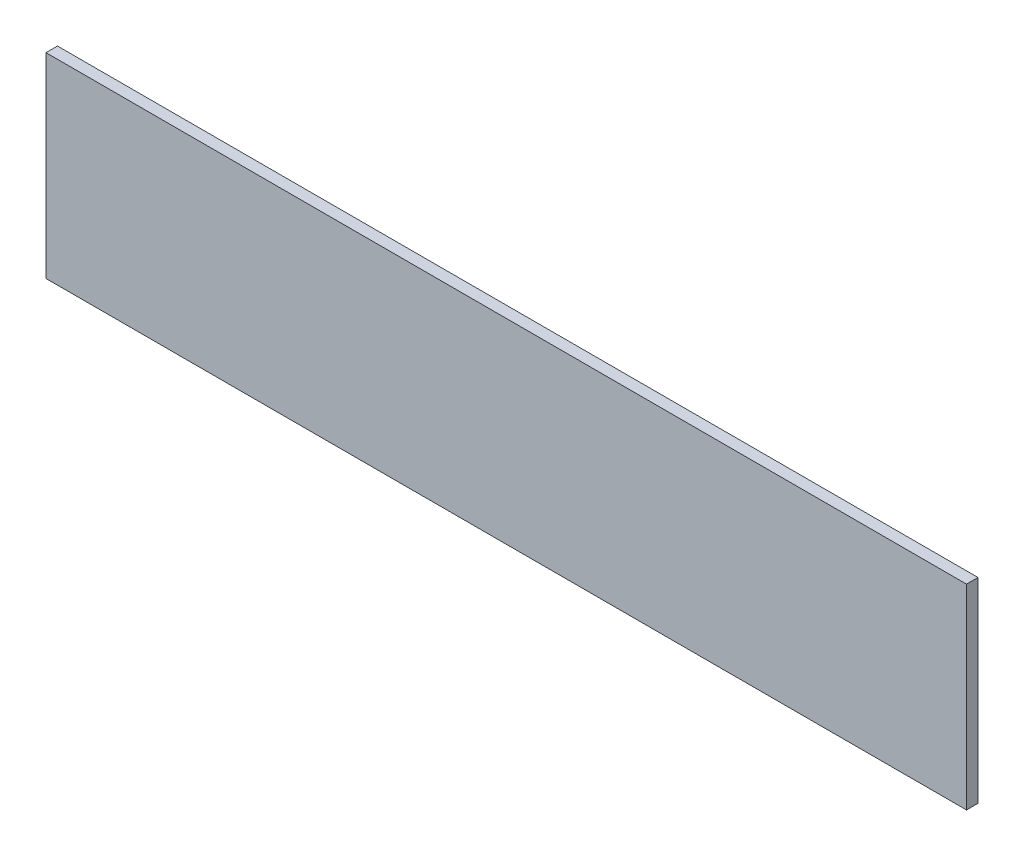
ISO-10303-21;
HEADER;
FILE_DESCRIPTION(('STEP AP214'),'2;1');
FILE_NAME('part.step','',(''),(''),'','','');
FILE_SCHEMA(('AUTOMOTIVE_DESIGN { 1 0 10303 214 1 1 1 1 }'));
ENDSEC;
DATA;
#1=APPLICATION_CONTEXT('core data for automotive mechanical design processes');
#2=APPLICATION_PROTOCOL_DEFINITION('international standard','automotive_design',2000,#1);
#3=PRODUCT_CONTEXT('',#1,'mechanical');
#4=PRODUCT('Part','Part','',(#3));
#5=PRODUCT_RELATED_PRODUCT_CATEGORY('part','',(#4));
#6=PRODUCT_DEFINITION_FORMATION('','',#4);
#7=PRODUCT_DEFINITION_CONTEXT('part definition',#1,'design');
#8=PRODUCT_DEFINITION('design','',#6,#7);
#9=PRODUCT_DEFINITION_SHAPE('','',#8);
#10=(LENGTH_UNIT() NAMED_UNIT(*) SI_UNIT(.MILLI.,.METRE.));
#11=(NAMED_UNIT(*) PLANE_ANGLE_UNIT() SI_UNIT($,.RADIAN.));
#12=(NAMED_UNIT(*) SI_UNIT($,.STERADIAN.) SOLID_ANGLE_UNIT());
#13=UNCERTAINTY_MEASURE_WITH_UNIT(LENGTH_MEASURE(1.E-05),#10,'distance_accuracy_value','');
#14=(GEOMETRIC_REPRESENTATION_CONTEXT(3) GLOBAL_UNCERTAINTY_ASSIGNED_CONTEXT((#13)) GLOBAL_UNIT_ASSIGNED_CONTEXT((#10,
#11,#12)) REPRESENTATION_CONTEXT('',''));
#15=CARTESIAN_POINT('',(0.,0.,0.));
#16=DIRECTION('',(0.,0.,1.));
#17=DIRECTION('',(1.,0.,0.));
#18=AXIS2_PLACEMENT_3D('',#15,#16,#17);
#19=CARTESIAN_POINT('',(0.,0.,5.));
#20=DIRECTION('',(1.,0.,0.));
#21=DIRECTION('',(0.,0.,-1.));
#22=AXIS2_PLACEMENT_3D('',#19,#20,#21);
#23=PLANE('',#22);
#24=DIRECTION('',(0.,-1.,0.));
#25=VECTOR('',#24,1.);
#26=CARTESIAN_POINT('',(0.,0.,0.));
#27=LINE('',#26,#25);
#28=CARTESIAN_POINT('',(0.,85.,0.));
#29=VERTEX_POINT('',#28);
#30=CARTESIAN_POINT('',(0.,0.,0.));
#31=VERTEX_POINT('',#30);
#32=EDGE_CURVE('E96',#29,#31,#27,.T.);
#33=ORIENTED_EDGE('',*,*,#32,.T.);
#34=DIRECTION('',(0.,0.,-1.));
#35=VECTOR('',#34,1.);
#36=CARTESIAN_POINT('',(0.,0.,5.));
#37=LINE('',#36,#35);
#38=CARTESIAN_POINT('',(0.,0.,5.));
#39=VERTEX_POINT('',#38);
#40=EDGE_CURVE('E11',#39,#31,#37,.T.);
#41=ORIENTED_EDGE('',*,*,#40,.F.);
#42=DIRECTION('',(0.,-1.,0.));
#43=VECTOR('',#42,1.);
#44=CARTESIAN_POINT('',(0.,0.,5.));
#45=LINE('',#44,#43);
#46=CARTESIAN_POINT('',(0.,85.,5.));
#47=VERTEX_POINT('',#46);
#48=EDGE_CURVE('E84',#47,#39,#45,.T.);
#49=ORIENTED_EDGE('',*,*,#48,.F.);
#50=DIRECTION('',(0.,0.,-1.));
#51=VECTOR('',#50,1.);
#52=CARTESIAN_POINT('',(0.,85.,5.));
#53=LINE('',#52,#51);
#54=EDGE_CURVE('E92',#47,#29,#53,.T.);
#55=ORIENTED_EDGE('',*,*,#54,.T.);
#56=EDGE_LOOP('',(#33,#41,#49,#55));
#57=FACE_BOUND('',#56,.T.);
#58=ADVANCED_FACE('F33',(#57),#23,.F.);
#59=CARTESIAN_POINT('',(0.,0.,5.));
#60=DIRECTION('',(0.,1.,0.));
#61=DIRECTION('',(0.,0.,1.));
#62=AXIS2_PLACEMENT_3D('',#59,#60,#61);
#63=PLANE('',#62);
#64=DIRECTION('',(1.,0.,0.));
#65=VECTOR('',#64,1.);
#66=CARTESIAN_POINT('',(0.,0.,0.));
#67=LINE('',#66,#65);
#68=CARTESIAN_POINT('',(400.,0.,0.));
#69=VERTEX_POINT('',#68);
#70=EDGE_CURVE('E88',#31,#69,#67,.T.);
#71=ORIENTED_EDGE('',*,*,#70,.T.);
#72=DIRECTION('',(0.,0.,-1.));
#73=VECTOR('',#72,1.);
#74=CARTESIAN_POINT('',(400.,0.,5.));
#75=LINE('',#74,#73);
#76=CARTESIAN_POINT('',(400.,0.,5.));
#77=VERTEX_POINT('',#76);
#78=EDGE_CURVE('E41',#77,#69,#75,.T.);
#79=ORIENTED_EDGE('',*,*,#78,.F.);
#80=DIRECTION('',(1.,0.,0.));
#81=VECTOR('',#80,1.);
#82=CARTESIAN_POINT('',(0.,0.,5.));
#83=LINE('',#82,#81);
#84=EDGE_CURVE('E79',#39,#77,#83,.T.);
#85=ORIENTED_EDGE('',*,*,#84,.F.);
#86=ORIENTED_EDGE('',*,*,#40,.T.);
#87=EDGE_LOOP('',(#71,#79,#85,#86));
#88=FACE_BOUND('',#87,.T.);
#89=ADVANCED_FACE('F87',(#88),#63,.F.);
#90=CARTESIAN_POINT('',(400.,0.,5.));
#91=DIRECTION('',(-1.,0.,0.));
#92=DIRECTION('',(0.,0.,1.));
#93=AXIS2_PLACEMENT_3D('',#90,#91,#92);
#94=PLANE('',#93);
#95=DIRECTION('',(0.,1.,0.));
#96=VECTOR('',#95,1.);
#97=CARTESIAN_POINT('',(400.,0.,0.));
#98=LINE('',#97,#96);
#99=CARTESIAN_POINT('',(400.,85.,0.));
#100=VERTEX_POINT('',#99);
#101=EDGE_CURVE('E66',#69,#100,#98,.T.);
#102=ORIENTED_EDGE('',*,*,#101,.T.);
#103=DIRECTION('',(0.,0.,-1.));
#104=VECTOR('',#103,1.);
#105=CARTESIAN_POINT('',(400.,85.,5.));
#106=LINE('',#105,#104);
#107=CARTESIAN_POINT('',(400.,85.,5.));
#108=VERTEX_POINT('',#107);
#109=EDGE_CURVE('E89',#108,#100,#106,.T.);
#110=ORIENTED_EDGE('',*,*,#109,.F.);
#111=DIRECTION('',(0.,1.,0.));
#112=VECTOR('',#111,1.);
#113=CARTESIAN_POINT('',(400.,0.,5.));
#114=LINE('',#113,#112);
#115=EDGE_CURVE('E82',#77,#108,#114,.T.);
#116=ORIENTED_EDGE('',*,*,#115,.F.);
#117=ORIENTED_EDGE('',*,*,#78,.T.);
#118=EDGE_LOOP('',(#102,#110,#116,#117));
#119=FACE_BOUND('',#118,.T.);
#120=ADVANCED_FACE('F90',(#119),#94,.F.);
#121=CARTESIAN_POINT('',(0.,85.,5.));
#122=DIRECTION('',(0.,-1.,0.));
#123=DIRECTION('',(0.,0.,-1.));
#124=AXIS2_PLACEMENT_3D('',#121,#122,#123);
#125=PLANE('',#124);
#126=DIRECTION('',(-1.,0.,0.));
#127=VECTOR('',#126,1.);
#128=CARTESIAN_POINT('',(0.,85.,0.));
#129=LINE('',#128,#127);
#130=EDGE_CURVE('E72',#100,#29,#129,.T.);
#131=ORIENTED_EDGE('',*,*,#130,.T.);
#132=ORIENTED_EDGE('',*,*,#54,.F.);
#133=DIRECTION('',(-1.,0.,0.));
#134=VECTOR('',#133,1.);
#135=CARTESIAN_POINT('',(0.,85.,5.));
#136=LINE('',#135,#134);
#137=EDGE_CURVE('E49',#108,#47,#136,.T.);
#138=ORIENTED_EDGE('',*,*,#137,.F.);
#139=ORIENTED_EDGE('',*,*,#109,.T.);
#140=EDGE_LOOP('',(#131,#132,#138,#139));
#141=FACE_BOUND('',#140,.T.);
#142=ADVANCED_FACE('F103',(#141),#125,.F.);
#143=CARTESIAN_POINT('',(0.,0.,5.));
#144=DIRECTION('',(0.,0.,-1.));
#145=DIRECTION('',(-1.,0.,0.));
#146=AXIS2_PLACEMENT_3D('',#143,#144,#145);
#147=PLANE('',#146);
#148=ORIENTED_EDGE('',*,*,#48,.T.);
#149=ORIENTED_EDGE('',*,*,#84,.T.);
#150=ORIENTED_EDGE('',*,*,#115,.T.);
#151=ORIENTED_EDGE('',*,*,#137,.T.);
#152=EDGE_LOOP('',(#148,#149,#150,#151));
#153=FACE_BOUND('',#152,.T.);
#154=ADVANCED_FACE('F80',(#153),#147,.F.);
#155=CARTESIAN_POINT('',(0.,0.,0.));
#156=DIRECTION('',(0.,0.,-1.));
#157=DIRECTION('',(-1.,0.,0.));
#158=AXIS2_PLACEMENT_3D('',#155,#156,#157);
#159=PLANE('',#158);
#160=ORIENTED_EDGE('',*,*,#32,.F.);
#161=ORIENTED_EDGE('',*,*,#130,.F.);
#162=ORIENTED_EDGE('',*,*,#101,.F.);
#163=ORIENTED_EDGE('',*,*,#70,.F.);
#164=EDGE_LOOP('',(#160,#161,#162,#163));
#165=FACE_BOUND('',#164,.T.);
#166=ADVANCED_FACE('F106',(#165),#159,.T.);
#167=CLOSED_SHELL('',(#58,#89,#120,#142,#154,#166));
#168=MANIFOLD_SOLID_BREP('B2',#167);
#169=ADVANCED_BREP_SHAPE_REPRESENTATION('',(#18,#168),#14);
#170=SHAPE_DEFINITION_REPRESENTATION(#9,#169);
ENDSEC;
END-ISO-10303-21;
